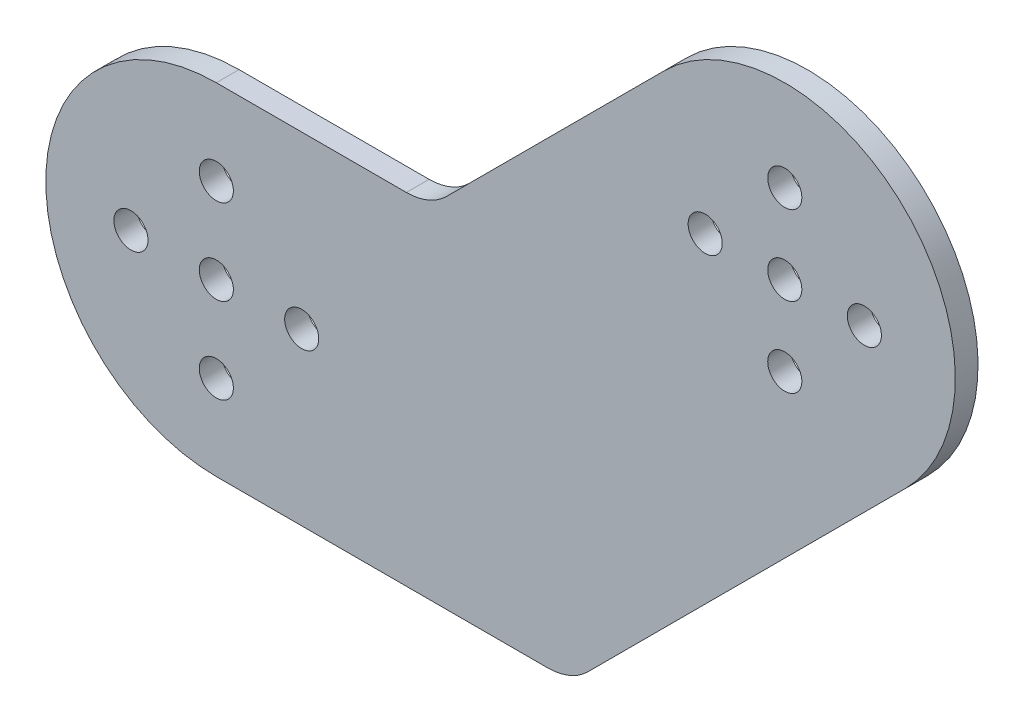
ISO-10303-21;
HEADER;
FILE_DESCRIPTION(('STEP AP214'),'2;1');
FILE_NAME('part.step','',(''),(''),'','','');
FILE_SCHEMA(('AUTOMOTIVE_DESIGN { 1 0 10303 214 1 1 1 1 }'));
ENDSEC;
DATA;
#1=APPLICATION_CONTEXT('core data for automotive mechanical design processes');
#2=APPLICATION_PROTOCOL_DEFINITION('international standard','automotive_design',2000,#1);
#3=PRODUCT_CONTEXT('',#1,'mechanical');
#4=PRODUCT('Part','Part','',(#3));
#5=PRODUCT_RELATED_PRODUCT_CATEGORY('part','',(#4));
#6=PRODUCT_DEFINITION_FORMATION('','',#4);
#7=PRODUCT_DEFINITION_CONTEXT('part definition',#1,'design');
#8=PRODUCT_DEFINITION('design','',#6,#7);
#9=PRODUCT_DEFINITION_SHAPE('','',#8);
#10=(LENGTH_UNIT() NAMED_UNIT(*) SI_UNIT(.MILLI.,.METRE.));
#11=(NAMED_UNIT(*) PLANE_ANGLE_UNIT() SI_UNIT($,.RADIAN.));
#12=(NAMED_UNIT(*) SI_UNIT($,.STERADIAN.) SOLID_ANGLE_UNIT());
#13=UNCERTAINTY_MEASURE_WITH_UNIT(LENGTH_MEASURE(1.E-05),#10,'distance_accuracy_value','');
#14=(GEOMETRIC_REPRESENTATION_CONTEXT(3) GLOBAL_UNCERTAINTY_ASSIGNED_CONTEXT((#13)) GLOBAL_UNIT_ASSIGNED_CONTEXT((#10,
#11,#12)) REPRESENTATION_CONTEXT('',''));
#15=CARTESIAN_POINT('',(0.,0.,0.));
#16=DIRECTION('',(0.,0.,1.));
#17=DIRECTION('',(1.,0.,0.));
#18=AXIS2_PLACEMENT_3D('',#15,#16,#17);
#19=CARTESIAN_POINT('',(0.,0.,2.));
#20=DIRECTION('',(0.,0.,1.));
#21=DIRECTION('',(1.,0.,0.));
#22=AXIS2_PLACEMENT_3D('',#19,#20,#21);
#23=PLANE('',#22);
#24=CARTESIAN_POINT('',(56.9999999995242,24.9999999995243,2.));
#25=DIRECTION('',(0.,0.,1.));
#26=DIRECTION('',(0.,-1.,0.));
#27=AXIS2_PLACEMENT_3D('',#24,#25,#26);
#28=CIRCLE('',#27,1.5);
#29=CARTESIAN_POINT('',(56.9999999995243,23.4999999995243,2.));
#30=VERTEX_POINT('',#29);
#31=EDGE_CURVE('E232',#30,#30,#28,.T.);
#32=ORIENTED_EDGE('',*,*,#31,.F.);
#33=EDGE_LOOP('',(#32));
#34=FACE_BOUND('',#33,.T.);
#35=CARTESIAN_POINT('',(49.9999999995242,17.9999999995242,2.));
#36=DIRECTION('',(0.,0.,1.));
#37=DIRECTION('',(-1.,0.,0.));
#38=AXIS2_PLACEMENT_3D('',#35,#36,#37);
#39=CIRCLE('',#38,1.5);
#40=CARTESIAN_POINT('',(48.4999999995242,17.9999999995242,2.));
#41=VERTEX_POINT('',#40);
#42=EDGE_CURVE('E226',#41,#41,#39,.T.);
#43=ORIENTED_EDGE('',*,*,#42,.F.);
#44=EDGE_LOOP('',(#43));
#45=FACE_BOUND('',#44,.T.);
#46=CARTESIAN_POINT('',(42.9999999995242,24.9999999995242,2.));
#47=DIRECTION('',(0.,0.,1.));
#48=DIRECTION('',(0.,1.,0.));
#49=AXIS2_PLACEMENT_3D('',#46,#47,#48);
#50=CIRCLE('',#49,1.5);
#51=CARTESIAN_POINT('',(42.9999999995242,26.4999999995242,2.));
#52=VERTEX_POINT('',#51);
#53=EDGE_CURVE('E220',#52,#52,#50,.T.);
#54=ORIENTED_EDGE('',*,*,#53,.F.);
#55=EDGE_LOOP('',(#54));
#56=FACE_BOUND('',#55,.T.);
#57=CARTESIAN_POINT('',(49.9999999995242,31.9999999995242,2.));
#58=DIRECTION('',(0.,0.,1.));
#59=DIRECTION('',(1.,0.,0.));
#60=AXIS2_PLACEMENT_3D('',#57,#58,#59);
#61=CIRCLE('',#60,1.5);
#62=CARTESIAN_POINT('',(51.4999999995242,31.9999999995242,2.));
#63=VERTEX_POINT('',#62);
#64=EDGE_CURVE('E214',#63,#63,#61,.T.);
#65=ORIENTED_EDGE('',*,*,#64,.F.);
#66=EDGE_LOOP('',(#65));
#67=FACE_BOUND('',#66,.T.);
#68=CARTESIAN_POINT('',(49.9999999995242,24.9999999995242,2.));
#69=DIRECTION('',(0.,0.,1.));
#70=DIRECTION('',(1.,0.,0.));
#71=AXIS2_PLACEMENT_3D('',#68,#69,#70);
#72=CIRCLE('',#71,1.5);
#73=CARTESIAN_POINT('',(51.4999999995242,24.9999999995242,2.));
#74=VERTEX_POINT('',#73);
#75=EDGE_CURVE('E208',#74,#74,#72,.T.);
#76=ORIENTED_EDGE('',*,*,#75,.F.);
#77=EDGE_LOOP('',(#76));
#78=FACE_BOUND('',#77,.T.);
#79=CARTESIAN_POINT('',(0.,-7.50979876784262,2.));
#80=DIRECTION('',(0.,0.,1.));
#81=DIRECTION('',(-1.,0.,0.));
#82=AXIS2_PLACEMENT_3D('',#79,#80,#81);
#83=CIRCLE('',#82,1.5);
#84=CARTESIAN_POINT('',(-1.5,-7.50979876784262,2.));
#85=VERTEX_POINT('',#84);
#86=EDGE_CURVE('E193',#85,#85,#83,.T.);
#87=ORIENTED_EDGE('',*,*,#86,.F.);
#88=EDGE_LOOP('',(#87));
#89=FACE_BOUND('',#88,.T.);
#90=CARTESIAN_POINT('',(0.,7.50979876784262,2.));
#91=DIRECTION('',(0.,0.,1.));
#92=DIRECTION('',(1.,0.,0.));
#93=AXIS2_PLACEMENT_3D('',#90,#91,#92);
#94=CIRCLE('',#93,1.5);
#95=CARTESIAN_POINT('',(1.5,7.50979876784262,2.));
#96=VERTEX_POINT('',#95);
#97=EDGE_CURVE('E181',#96,#96,#94,.T.);
#98=ORIENTED_EDGE('',*,*,#97,.F.);
#99=EDGE_LOOP('',(#98));
#100=FACE_BOUND('',#99,.T.);
#101=CARTESIAN_POINT('',(0.,0.,2.));
#102=DIRECTION('',(0.,0.,1.));
#103=DIRECTION('',(1.,0.,0.));
#104=AXIS2_PLACEMENT_3D('',#101,#102,#103);
#105=CIRCLE('',#104,15.);
#106=CARTESIAN_POINT('',(0.,15.,2.));
#107=VERTEX_POINT('',#106);
#108=CARTESIAN_POINT('',(0.,-15.,2.));
#109=VERTEX_POINT('',#108);
#110=EDGE_CURVE('E144',#107,#109,#105,.T.);
#111=ORIENTED_EDGE('',*,*,#110,.T.);
#112=DIRECTION('',(1.,0.,0.));
#113=VECTOR('',#112,1.);
#114=CARTESIAN_POINT('',(29.1421356237315,-15.0000000000001,2.));
#115=LINE('',#114,#113);
#116=CARTESIAN_POINT('',(29.1421356237315,-15.0000000000001,2.));
#117=VERTEX_POINT('',#116);
#118=EDGE_CURVE('E92',#109,#117,#115,.T.);
#119=ORIENTED_EDGE('',*,*,#118,.T.);
#120=CARTESIAN_POINT('',(29.1421356237316,-10.0000000000001,2.));
#121=DIRECTION('',(0.,0.,1.));
#122=DIRECTION('',(-1.,0.,0.));
#123=AXIS2_PLACEMENT_3D('',#120,#121,#122);
#124=CIRCLE('',#123,4.99999999999996);
#125=CARTESIAN_POINT('',(32.6776695296644,-13.5355339059327,2.));
#126=VERTEX_POINT('',#125);
#127=EDGE_CURVE('E159',#117,#126,#124,.T.);
#128=ORIENTED_EDGE('',*,*,#127,.T.);
#129=DIRECTION('',(0.707106781186539,0.707106781186556,0.));
#130=VECTOR('',#129,1.);
#131=CARTESIAN_POINT('',(60.6066017173227,14.3933982817263,2.));
#132=LINE('',#131,#130);
#133=CARTESIAN_POINT('',(60.6066017173227,14.3933982817263,2.));
#134=VERTEX_POINT('',#133);
#135=EDGE_CURVE('E172',#126,#134,#132,.T.);
#136=ORIENTED_EDGE('',*,*,#135,.T.);
#137=CARTESIAN_POINT('',(49.9999999995244,24.9999999995244,2.));
#138=DIRECTION('',(0.,0.,1.));
#139=DIRECTION('',(-1.,0.,0.));
#140=AXIS2_PLACEMENT_3D('',#137,#138,#139);
#141=CIRCLE('',#140,15.);
#142=CARTESIAN_POINT('',(39.393398281726,35.6066017173225,2.));
#143=VERTEX_POINT('',#142);
#144=EDGE_CURVE('E111',#134,#143,#141,.T.);
#145=ORIENTED_EDGE('',*,*,#144,.T.);
#146=DIRECTION('',(-0.707106781186539,-0.707106781186556,0.));
#147=VECTOR('',#146,1.);
#148=CARTESIAN_POINT('',(20.2512626584713,16.4644660940672,2.));
#149=LINE('',#148,#147);
#150=CARTESIAN_POINT('',(20.2512626584713,16.4644660940672,2.));
#151=VERTEX_POINT('',#150);
#152=EDGE_CURVE('E105',#143,#151,#149,.T.);
#153=ORIENTED_EDGE('',*,*,#152,.T.);
#154=CARTESIAN_POINT('',(16.7157287525385,19.9999999999999,2.));
#155=DIRECTION('',(0.,0.,-1.));
#156=DIRECTION('',(1.,0.,0.));
#157=AXIS2_PLACEMENT_3D('',#154,#155,#156);
#158=CIRCLE('',#157,5.);
#159=CARTESIAN_POINT('',(16.7157287525385,14.9999999999999,2.));
#160=VERTEX_POINT('',#159);
#161=EDGE_CURVE('E109',#151,#160,#158,.T.);
#162=ORIENTED_EDGE('',*,*,#161,.T.);
#163=DIRECTION('',(-1.,0.,0.));
#164=VECTOR('',#163,1.);
#165=CARTESIAN_POINT('',(0.,15.,2.));
#166=LINE('',#165,#164);
#167=EDGE_CURVE('E49',#160,#107,#166,.T.);
#168=ORIENTED_EDGE('',*,*,#167,.T.);
#169=EDGE_LOOP('',(#111,#119,#128,#136,#145,#153,#162,#168));
#170=FACE_BOUND('',#169,.T.);
#171=CARTESIAN_POINT('',(0.,0.,2.));
#172=DIRECTION('',(0.,0.,1.));
#173=DIRECTION('',(1.,0.,0.));
#174=AXIS2_PLACEMENT_3D('',#171,#172,#173);
#175=CIRCLE('',#174,1.5);
#176=CARTESIAN_POINT('',(1.5,0.,2.));
#177=VERTEX_POINT('',#176);
#178=EDGE_CURVE('E133',#177,#177,#175,.T.);
#179=ORIENTED_EDGE('',*,*,#178,.F.);
#180=EDGE_LOOP('',(#179));
#181=FACE_BOUND('',#180,.T.);
#182=CARTESIAN_POINT('',(-7.50979876784262,0.,2.));
#183=DIRECTION('',(0.,0.,1.));
#184=DIRECTION('',(0.,1.,0.));
#185=AXIS2_PLACEMENT_3D('',#182,#183,#184);
#186=CIRCLE('',#185,1.5);
#187=CARTESIAN_POINT('',(-7.50979876784262,1.49999999999997,2.));
#188=VERTEX_POINT('',#187);
#189=EDGE_CURVE('E187',#188,#188,#186,.T.);
#190=ORIENTED_EDGE('',*,*,#189,.F.);
#191=EDGE_LOOP('',(#190));
#192=FACE_BOUND('',#191,.T.);
#193=CARTESIAN_POINT('',(7.50979876784262,0.,2.));
#194=DIRECTION('',(0.,0.,1.));
#195=DIRECTION('',(0.,-1.,0.));
#196=AXIS2_PLACEMENT_3D('',#193,#194,#195);
#197=CIRCLE('',#196,1.5);
#198=CARTESIAN_POINT('',(7.50979876784263,-1.49999999999992,2.));
#199=VERTEX_POINT('',#198);
#200=EDGE_CURVE('E199',#199,#199,#197,.T.);
#201=ORIENTED_EDGE('',*,*,#200,.F.);
#202=EDGE_LOOP('',(#201));
#203=FACE_BOUND('',#202,.T.);
#204=ADVANCED_FACE('F32',(#34,#45,#56,#67,#78,#89,#100,#170,#181,#192,#203),#23,.T.);
#205=CARTESIAN_POINT('',(0.,0.,0.));
#206=DIRECTION('',(0.,0.,1.));
#207=DIRECTION('',(1.,0.,0.));
#208=AXIS2_PLACEMENT_3D('',#205,#206,#207);
#209=PLANE('',#208);
#210=CARTESIAN_POINT('',(56.9999999995242,24.9999999995243,0.));
#211=DIRECTION('',(0.,0.,1.));
#212=DIRECTION('',(0.,-1.,0.));
#213=AXIS2_PLACEMENT_3D('',#210,#211,#212);
#214=CIRCLE('',#213,1.5);
#215=CARTESIAN_POINT('',(56.9999999995243,23.4999999995243,0.));
#216=VERTEX_POINT('',#215);
#217=EDGE_CURVE('E229',#216,#216,#214,.T.);
#218=ORIENTED_EDGE('',*,*,#217,.T.);
#219=EDGE_LOOP('',(#218));
#220=FACE_BOUND('',#219,.T.);
#221=CARTESIAN_POINT('',(49.9999999995242,17.9999999995242,0.));
#222=DIRECTION('',(0.,0.,1.));
#223=DIRECTION('',(-1.,0.,0.));
#224=AXIS2_PLACEMENT_3D('',#221,#222,#223);
#225=CIRCLE('',#224,1.5);
#226=CARTESIAN_POINT('',(48.4999999995242,17.9999999995242,0.));
#227=VERTEX_POINT('',#226);
#228=EDGE_CURVE('E223',#227,#227,#225,.T.);
#229=ORIENTED_EDGE('',*,*,#228,.T.);
#230=EDGE_LOOP('',(#229));
#231=FACE_BOUND('',#230,.T.);
#232=CARTESIAN_POINT('',(42.9999999995242,24.9999999995242,0.));
#233=DIRECTION('',(0.,0.,1.));
#234=DIRECTION('',(0.,1.,0.));
#235=AXIS2_PLACEMENT_3D('',#232,#233,#234);
#236=CIRCLE('',#235,1.5);
#237=CARTESIAN_POINT('',(42.9999999995242,26.4999999995242,0.));
#238=VERTEX_POINT('',#237);
#239=EDGE_CURVE('E217',#238,#238,#236,.T.);
#240=ORIENTED_EDGE('',*,*,#239,.T.);
#241=EDGE_LOOP('',(#240));
#242=FACE_BOUND('',#241,.T.);
#243=CARTESIAN_POINT('',(49.9999999995242,31.9999999995242,0.));
#244=DIRECTION('',(0.,0.,1.));
#245=DIRECTION('',(1.,0.,0.));
#246=AXIS2_PLACEMENT_3D('',#243,#244,#245);
#247=CIRCLE('',#246,1.5);
#248=CARTESIAN_POINT('',(51.4999999995242,31.9999999995242,0.));
#249=VERTEX_POINT('',#248);
#250=EDGE_CURVE('E211',#249,#249,#247,.T.);
#251=ORIENTED_EDGE('',*,*,#250,.T.);
#252=EDGE_LOOP('',(#251));
#253=FACE_BOUND('',#252,.T.);
#254=CARTESIAN_POINT('',(49.9999999995242,24.9999999995242,0.));
#255=DIRECTION('',(0.,0.,1.));
#256=DIRECTION('',(1.,0.,0.));
#257=AXIS2_PLACEMENT_3D('',#254,#255,#256);
#258=CIRCLE('',#257,1.5);
#259=CARTESIAN_POINT('',(51.4999999995242,24.9999999995242,0.));
#260=VERTEX_POINT('',#259);
#261=EDGE_CURVE('E205',#260,#260,#258,.T.);
#262=ORIENTED_EDGE('',*,*,#261,.T.);
#263=EDGE_LOOP('',(#262));
#264=FACE_BOUND('',#263,.T.);
#265=CARTESIAN_POINT('',(0.,-7.50979876784262,0.));
#266=DIRECTION('',(0.,0.,1.));
#267=DIRECTION('',(-1.,0.,0.));
#268=AXIS2_PLACEMENT_3D('',#265,#266,#267);
#269=CIRCLE('',#268,1.5);
#270=CARTESIAN_POINT('',(-1.5,-7.50979876784262,0.));
#271=VERTEX_POINT('',#270);
#272=EDGE_CURVE('E196',#271,#271,#269,.T.);
#273=ORIENTED_EDGE('',*,*,#272,.T.);
#274=EDGE_LOOP('',(#273));
#275=FACE_BOUND('',#274,.T.);
#276=CARTESIAN_POINT('',(0.,7.50979876784262,0.));
#277=DIRECTION('',(0.,0.,1.));
#278=DIRECTION('',(1.,0.,0.));
#279=AXIS2_PLACEMENT_3D('',#276,#277,#278);
#280=CIRCLE('',#279,1.5);
#281=CARTESIAN_POINT('',(1.5,7.50979876784262,0.));
#282=VERTEX_POINT('',#281);
#283=EDGE_CURVE('E184',#282,#282,#280,.T.);
#284=ORIENTED_EDGE('',*,*,#283,.T.);
#285=EDGE_LOOP('',(#284));
#286=FACE_BOUND('',#285,.T.);
#287=CARTESIAN_POINT('',(0.,0.,0.));
#288=DIRECTION('',(0.,0.,1.));
#289=DIRECTION('',(1.,0.,0.));
#290=AXIS2_PLACEMENT_3D('',#287,#288,#289);
#291=CIRCLE('',#290,15.);
#292=CARTESIAN_POINT('',(0.,15.,0.));
#293=VERTEX_POINT('',#292);
#294=CARTESIAN_POINT('',(0.,-15.,0.));
#295=VERTEX_POINT('',#294);
#296=EDGE_CURVE('E129',#293,#295,#291,.T.);
#297=ORIENTED_EDGE('',*,*,#296,.F.);
#298=DIRECTION('',(-1.,0.,0.));
#299=VECTOR('',#298,1.);
#300=CARTESIAN_POINT('',(0.,15.,0.));
#301=LINE('',#300,#299);
#302=CARTESIAN_POINT('',(16.7157287525385,14.9999999999999,0.));
#303=VERTEX_POINT('',#302);
#304=EDGE_CURVE('E84',#303,#293,#301,.T.);
#305=ORIENTED_EDGE('',*,*,#304,.F.);
#306=CARTESIAN_POINT('',(16.7157287525385,19.9999999999999,0.));
#307=DIRECTION('',(0.,0.,-1.));
#308=DIRECTION('',(1.,0.,0.));
#309=AXIS2_PLACEMENT_3D('',#306,#307,#308);
#310=CIRCLE('',#309,5.);
#311=CARTESIAN_POINT('',(20.2512626584713,16.4644660940672,0.));
#312=VERTEX_POINT('',#311);
#313=EDGE_CURVE('E78',#312,#303,#310,.T.);
#314=ORIENTED_EDGE('',*,*,#313,.F.);
#315=DIRECTION('',(-0.707106781186539,-0.707106781186556,0.));
#316=VECTOR('',#315,1.);
#317=CARTESIAN_POINT('',(20.2512626584713,16.4644660940672,0.));
#318=LINE('',#317,#316);
#319=CARTESIAN_POINT('',(39.393398281726,35.6066017173225,0.));
#320=VERTEX_POINT('',#319);
#321=EDGE_CURVE('E119',#320,#312,#318,.T.);
#322=ORIENTED_EDGE('',*,*,#321,.F.);
#323=CARTESIAN_POINT('',(49.9999999995244,24.9999999995244,0.));
#324=DIRECTION('',(0.,0.,1.));
#325=DIRECTION('',(-1.,0.,0.));
#326=AXIS2_PLACEMENT_3D('',#323,#324,#325);
#327=CIRCLE('',#326,15.);
#328=CARTESIAN_POINT('',(60.6066017173227,14.3933982817263,0.));
#329=VERTEX_POINT('',#328);
#330=EDGE_CURVE('E139',#329,#320,#327,.T.);
#331=ORIENTED_EDGE('',*,*,#330,.F.);
#332=DIRECTION('',(0.707106781186539,0.707106781186556,0.));
#333=VECTOR('',#332,1.);
#334=CARTESIAN_POINT('',(60.6066017173227,14.3933982817263,0.));
#335=LINE('',#334,#333);
#336=CARTESIAN_POINT('',(32.6776695296644,-13.5355339059327,0.));
#337=VERTEX_POINT('',#336);
#338=EDGE_CURVE('E137',#337,#329,#335,.T.);
#339=ORIENTED_EDGE('',*,*,#338,.F.);
#340=CARTESIAN_POINT('',(29.1421356237316,-10.0000000000001,0.));
#341=DIRECTION('',(0.,0.,1.));
#342=DIRECTION('',(-1.,0.,0.));
#343=AXIS2_PLACEMENT_3D('',#340,#341,#342);
#344=CIRCLE('',#343,4.99999999999996);
#345=CARTESIAN_POINT('',(29.1421356237315,-15.0000000000001,0.));
#346=VERTEX_POINT('',#345);
#347=EDGE_CURVE('E135',#346,#337,#344,.T.);
#348=ORIENTED_EDGE('',*,*,#347,.F.);
#349=DIRECTION('',(1.,0.,0.));
#350=VECTOR('',#349,1.);
#351=CARTESIAN_POINT('',(29.1421356237315,-15.0000000000001,0.));
#352=LINE('',#351,#350);
#353=EDGE_CURVE('E132',#295,#346,#352,.T.);
#354=ORIENTED_EDGE('',*,*,#353,.F.);
#355=EDGE_LOOP('',(#297,#305,#314,#322,#331,#339,#348,#354));
#356=FACE_BOUND('',#355,.T.);
#357=CARTESIAN_POINT('',(0.,0.,0.));
#358=DIRECTION('',(0.,0.,1.));
#359=DIRECTION('',(1.,0.,0.));
#360=AXIS2_PLACEMENT_3D('',#357,#358,#359);
#361=CIRCLE('',#360,1.5);
#362=CARTESIAN_POINT('',(1.5,0.,0.));
#363=VERTEX_POINT('',#362);
#364=EDGE_CURVE('E178',#363,#363,#361,.T.);
#365=ORIENTED_EDGE('',*,*,#364,.T.);
#366=EDGE_LOOP('',(#365));
#367=FACE_BOUND('',#366,.T.);
#368=CARTESIAN_POINT('',(-7.50979876784262,0.,0.));
#369=DIRECTION('',(0.,0.,1.));
#370=DIRECTION('',(0.,1.,0.));
#371=AXIS2_PLACEMENT_3D('',#368,#369,#370);
#372=CIRCLE('',#371,1.5);
#373=CARTESIAN_POINT('',(-7.50979876784262,1.49999999999997,0.));
#374=VERTEX_POINT('',#373);
#375=EDGE_CURVE('E190',#374,#374,#372,.T.);
#376=ORIENTED_EDGE('',*,*,#375,.T.);
#377=EDGE_LOOP('',(#376));
#378=FACE_BOUND('',#377,.T.);
#379=CARTESIAN_POINT('',(7.50979876784262,0.,0.));
#380=DIRECTION('',(0.,0.,1.));
#381=DIRECTION('',(0.,-1.,0.));
#382=AXIS2_PLACEMENT_3D('',#379,#380,#381);
#383=CIRCLE('',#382,1.5);
#384=CARTESIAN_POINT('',(7.50979876784263,-1.49999999999992,0.));
#385=VERTEX_POINT('',#384);
#386=EDGE_CURVE('E202',#385,#385,#383,.T.);
#387=ORIENTED_EDGE('',*,*,#386,.T.);
#388=EDGE_LOOP('',(#387));
#389=FACE_BOUND('',#388,.T.);
#390=ADVANCED_FACE('F163',(#220,#231,#242,#253,#264,#275,#286,#356,#367,#378,#389),#209,.F.);
#391=CARTESIAN_POINT('',(0.,0.,2.));
#392=DIRECTION('',(0.,0.,-1.));
#393=DIRECTION('',(-1.,0.,0.));
#394=AXIS2_PLACEMENT_3D('',#391,#392,#393);
#395=CYLINDRICAL_SURFACE('',#394,15.);
#396=ORIENTED_EDGE('',*,*,#296,.T.);
#397=DIRECTION('',(0.,0.,-1.));
#398=VECTOR('',#397,1.);
#399=CARTESIAN_POINT('',(0.,-15.,2.));
#400=LINE('',#399,#398);
#401=EDGE_CURVE('E11',#109,#295,#400,.T.);
#402=ORIENTED_EDGE('',*,*,#401,.F.);
#403=ORIENTED_EDGE('',*,*,#110,.F.);
#404=DIRECTION('',(0.,0.,-1.));
#405=VECTOR('',#404,1.);
#406=CARTESIAN_POINT('',(0.,15.,2.));
#407=LINE('',#406,#405);
#408=EDGE_CURVE('E125',#107,#293,#407,.T.);
#409=ORIENTED_EDGE('',*,*,#408,.T.);
#410=EDGE_LOOP('',(#396,#402,#403,#409));
#411=FACE_BOUND('',#410,.T.);
#412=ADVANCED_FACE('F34',(#411),#395,.T.);
#413=CARTESIAN_POINT('',(29.1421356237315,-15.0000000000001,2.));
#414=DIRECTION('',(0.,1.,0.));
#415=DIRECTION('',(-1.,0.,0.));
#416=AXIS2_PLACEMENT_3D('',#413,#414,#415);
#417=PLANE('',#416);
#418=ORIENTED_EDGE('',*,*,#353,.T.);
#419=DIRECTION('',(0.,0.,-1.));
#420=VECTOR('',#419,1.);
#421=CARTESIAN_POINT('',(29.1421356237315,-15.0000000000001,2.));
#422=LINE('',#421,#420);
#423=EDGE_CURVE('E41',#117,#346,#422,.T.);
#424=ORIENTED_EDGE('',*,*,#423,.F.);
#425=ORIENTED_EDGE('',*,*,#118,.F.);
#426=ORIENTED_EDGE('',*,*,#401,.T.);
#427=EDGE_LOOP('',(#418,#424,#425,#426));
#428=FACE_BOUND('',#427,.T.);
#429=ADVANCED_FACE('F275',(#428),#417,.F.);
#430=CARTESIAN_POINT('',(29.1421356237316,-10.0000000000001,2.));
#431=DIRECTION('',(0.,0.,-1.));
#432=DIRECTION('',(-1.,0.,0.));
#433=AXIS2_PLACEMENT_3D('',#430,#431,#432);
#434=CYLINDRICAL_SURFACE('',#433,4.99999999999996);
#435=ORIENTED_EDGE('',*,*,#347,.T.);
#436=DIRECTION('',(0.,0.,-1.));
#437=VECTOR('',#436,1.);
#438=CARTESIAN_POINT('',(32.6776695296644,-13.5355339059327,2.));
#439=LINE('',#438,#437);
#440=EDGE_CURVE('E151',#126,#337,#439,.T.);
#441=ORIENTED_EDGE('',*,*,#440,.F.);
#442=ORIENTED_EDGE('',*,*,#127,.F.);
#443=ORIENTED_EDGE('',*,*,#423,.T.);
#444=EDGE_LOOP('',(#435,#441,#442,#443));
#445=FACE_BOUND('',#444,.T.);
#446=ADVANCED_FACE('F157',(#445),#434,.T.);
#447=CARTESIAN_POINT('',(60.6066017173227,14.3933982817263,2.));
#448=DIRECTION('',(-0.707106781186556,0.707106781186539,0.));
#449=DIRECTION('',(-0.707106781186539,-0.707106781186556,0.));
#450=AXIS2_PLACEMENT_3D('',#447,#448,#449);
#451=PLANE('',#450);
#452=ORIENTED_EDGE('',*,*,#338,.T.);
#453=DIRECTION('',(0.,0.,-1.));
#454=VECTOR('',#453,1.);
#455=CARTESIAN_POINT('',(60.6066017173227,14.3933982817263,2.));
#456=LINE('',#455,#454);
#457=EDGE_CURVE('E148',#134,#329,#456,.T.);
#458=ORIENTED_EDGE('',*,*,#457,.F.);
#459=ORIENTED_EDGE('',*,*,#135,.F.);
#460=ORIENTED_EDGE('',*,*,#440,.T.);
#461=EDGE_LOOP('',(#452,#458,#459,#460));
#462=FACE_BOUND('',#461,.T.);
#463=ADVANCED_FACE('F168',(#462),#451,.F.);
#464=CARTESIAN_POINT('',(49.9999999995244,24.9999999995244,2.));
#465=DIRECTION('',(0.,0.,-1.));
#466=DIRECTION('',(-1.,0.,0.));
#467=AXIS2_PLACEMENT_3D('',#464,#465,#466);
#468=CYLINDRICAL_SURFACE('',#467,15.);
#469=ORIENTED_EDGE('',*,*,#330,.T.);
#470=DIRECTION('',(0.,0.,-1.));
#471=VECTOR('',#470,1.);
#472=CARTESIAN_POINT('',(39.393398281726,35.6066017173225,2.));
#473=LINE('',#472,#471);
#474=EDGE_CURVE('E120',#143,#320,#473,.T.);
#475=ORIENTED_EDGE('',*,*,#474,.F.);
#476=ORIENTED_EDGE('',*,*,#144,.F.);
#477=ORIENTED_EDGE('',*,*,#457,.T.);
#478=EDGE_LOOP('',(#469,#475,#476,#477));
#479=FACE_BOUND('',#478,.T.);
#480=ADVANCED_FACE('F171',(#479),#468,.T.);
#481=CARTESIAN_POINT('',(20.2512626584713,16.4644660940672,2.));
#482=DIRECTION('',(0.707106781186556,-0.707106781186539,0.));
#483=DIRECTION('',(0.707106781186539,0.707106781186556,0.));
#484=AXIS2_PLACEMENT_3D('',#481,#482,#483);
#485=PLANE('',#484);
#486=ORIENTED_EDGE('',*,*,#321,.T.);
#487=DIRECTION('',(0.,0.,-1.));
#488=VECTOR('',#487,1.);
#489=CARTESIAN_POINT('',(20.2512626584713,16.4644660940672,2.));
#490=LINE('',#489,#488);
#491=EDGE_CURVE('E116',#151,#312,#490,.T.);
#492=ORIENTED_EDGE('',*,*,#491,.F.);
#493=ORIENTED_EDGE('',*,*,#152,.F.);
#494=ORIENTED_EDGE('',*,*,#474,.T.);
#495=EDGE_LOOP('',(#486,#492,#493,#494));
#496=FACE_BOUND('',#495,.T.);
#497=ADVANCED_FACE('F117',(#496),#485,.F.);
#498=CARTESIAN_POINT('',(16.7157287525385,19.9999999999999,2.));
#499=DIRECTION('',(0.,0.,-1.));
#500=DIRECTION('',(-1.,0.,0.));
#501=AXIS2_PLACEMENT_3D('',#498,#499,#500);
#502=CYLINDRICAL_SURFACE('',#501,5.);
#503=ORIENTED_EDGE('',*,*,#313,.T.);
#504=DIRECTION('',(0.,0.,-1.));
#505=VECTOR('',#504,1.);
#506=CARTESIAN_POINT('',(16.7157287525385,14.9999999999999,2.));
#507=LINE('',#506,#505);
#508=EDGE_CURVE('E121',#160,#303,#507,.T.);
#509=ORIENTED_EDGE('',*,*,#508,.F.);
#510=ORIENTED_EDGE('',*,*,#161,.F.);
#511=ORIENTED_EDGE('',*,*,#491,.T.);
#512=EDGE_LOOP('',(#503,#509,#510,#511));
#513=FACE_BOUND('',#512,.T.);
#514=ADVANCED_FACE('F123',(#513),#502,.F.);
#515=CARTESIAN_POINT('',(0.,15.,2.));
#516=DIRECTION('',(0.,-1.,0.));
#517=DIRECTION('',(1.,0.,0.));
#518=AXIS2_PLACEMENT_3D('',#515,#516,#517);
#519=PLANE('',#518);
#520=ORIENTED_EDGE('',*,*,#304,.T.);
#521=ORIENTED_EDGE('',*,*,#408,.F.);
#522=ORIENTED_EDGE('',*,*,#167,.F.);
#523=ORIENTED_EDGE('',*,*,#508,.T.);
#524=EDGE_LOOP('',(#520,#521,#522,#523));
#525=FACE_BOUND('',#524,.T.);
#526=ADVANCED_FACE('F279',(#525),#519,.F.);
#527=CARTESIAN_POINT('',(0.,0.,2.));
#528=DIRECTION('',(0.,0.,-1.));
#529=DIRECTION('',(-1.,0.,0.));
#530=AXIS2_PLACEMENT_3D('',#527,#528,#529);
#531=CYLINDRICAL_SURFACE('',#530,1.5);
#532=ORIENTED_EDGE('',*,*,#178,.T.);
#533=EDGE_LOOP('',(#532));
#534=FACE_BOUND('',#533,.T.);
#535=ORIENTED_EDGE('',*,*,#364,.F.);
#536=EDGE_LOOP('',(#535));
#537=FACE_BOUND('',#536,.T.);
#538=ADVANCED_FACE('F266',(#534,#537),#531,.F.);
#539=CARTESIAN_POINT('',(0.,7.50979876784262,2.));
#540=DIRECTION('',(0.,0.,-1.));
#541=DIRECTION('',(-1.,0.,0.));
#542=AXIS2_PLACEMENT_3D('',#539,#540,#541);
#543=CYLINDRICAL_SURFACE('',#542,1.5);
#544=ORIENTED_EDGE('',*,*,#97,.T.);
#545=EDGE_LOOP('',(#544));
#546=FACE_BOUND('',#545,.T.);
#547=ORIENTED_EDGE('',*,*,#283,.F.);
#548=EDGE_LOOP('',(#547));
#549=FACE_BOUND('',#548,.T.);
#550=ADVANCED_FACE('F262',(#546,#549),#543,.F.);
#551=CARTESIAN_POINT('',(-7.50979876784262,0.,2.));
#552=DIRECTION('',(0.,0.,-1.));
#553=DIRECTION('',(-1.,0.,0.));
#554=AXIS2_PLACEMENT_3D('',#551,#552,#553);
#555=CYLINDRICAL_SURFACE('',#554,1.5);
#556=ORIENTED_EDGE('',*,*,#189,.T.);
#557=EDGE_LOOP('',(#556));
#558=FACE_BOUND('',#557,.T.);
#559=ORIENTED_EDGE('',*,*,#375,.F.);
#560=EDGE_LOOP('',(#559));
#561=FACE_BOUND('',#560,.T.);
#562=ADVANCED_FACE('F265',(#558,#561),#555,.F.);
#563=CARTESIAN_POINT('',(0.,-7.50979876784262,2.));
#564=DIRECTION('',(0.,0.,-1.));
#565=DIRECTION('',(-1.,0.,0.));
#566=AXIS2_PLACEMENT_3D('',#563,#564,#565);
#567=CYLINDRICAL_SURFACE('',#566,1.5);
#568=ORIENTED_EDGE('',*,*,#86,.T.);
#569=EDGE_LOOP('',(#568));
#570=FACE_BOUND('',#569,.T.);
#571=ORIENTED_EDGE('',*,*,#272,.F.);
#572=EDGE_LOOP('',(#571));
#573=FACE_BOUND('',#572,.T.);
#574=ADVANCED_FACE('F338',(#570,#573),#567,.F.);
#575=CARTESIAN_POINT('',(7.50979876784262,0.,2.));
#576=DIRECTION('',(0.,0.,-1.));
#577=DIRECTION('',(-1.,0.,0.));
#578=AXIS2_PLACEMENT_3D('',#575,#576,#577);
#579=CYLINDRICAL_SURFACE('',#578,1.5);
#580=ORIENTED_EDGE('',*,*,#200,.T.);
#581=EDGE_LOOP('',(#580));
#582=FACE_BOUND('',#581,.T.);
#583=ORIENTED_EDGE('',*,*,#386,.F.);
#584=EDGE_LOOP('',(#583));
#585=FACE_BOUND('',#584,.T.);
#586=ADVANCED_FACE('F346',(#582,#585),#579,.F.);
#587=CARTESIAN_POINT('',(49.9999999995242,24.9999999995242,0.));
#588=DIRECTION('',(0.,0.,1.));
#589=DIRECTION('',(1.,0.,0.));
#590=AXIS2_PLACEMENT_3D('',#587,#588,#589);
#591=CYLINDRICAL_SURFACE('',#590,1.5);
#592=ORIENTED_EDGE('',*,*,#261,.F.);
#593=EDGE_LOOP('',(#592));
#594=FACE_BOUND('',#593,.T.);
#595=ORIENTED_EDGE('',*,*,#75,.T.);
#596=EDGE_LOOP('',(#595));
#597=FACE_BOUND('',#596,.T.);
#598=ADVANCED_FACE('F354',(#594,#597),#591,.F.);
#599=CARTESIAN_POINT('',(49.9999999995242,31.9999999995242,0.));
#600=DIRECTION('',(0.,0.,1.));
#601=DIRECTION('',(1.,0.,0.));
#602=AXIS2_PLACEMENT_3D('',#599,#600,#601);
#603=CYLINDRICAL_SURFACE('',#602,1.5);
#604=ORIENTED_EDGE('',*,*,#250,.F.);
#605=EDGE_LOOP('',(#604));
#606=FACE_BOUND('',#605,.T.);
#607=ORIENTED_EDGE('',*,*,#64,.T.);
#608=EDGE_LOOP('',(#607));
#609=FACE_BOUND('',#608,.T.);
#610=ADVANCED_FACE('F362',(#606,#609),#603,.F.);
#611=CARTESIAN_POINT('',(42.9999999995242,24.9999999995242,0.));
#612=DIRECTION('',(0.,0.,1.));
#613=DIRECTION('',(1.,0.,0.));
#614=AXIS2_PLACEMENT_3D('',#611,#612,#613);
#615=CYLINDRICAL_SURFACE('',#614,1.5);
#616=ORIENTED_EDGE('',*,*,#239,.F.);
#617=EDGE_LOOP('',(#616));
#618=FACE_BOUND('',#617,.T.);
#619=ORIENTED_EDGE('',*,*,#53,.T.);
#620=EDGE_LOOP('',(#619));
#621=FACE_BOUND('',#620,.T.);
#622=ADVANCED_FACE('F370',(#618,#621),#615,.F.);
#623=CARTESIAN_POINT('',(49.9999999995242,17.9999999995242,0.));
#624=DIRECTION('',(0.,0.,1.));
#625=DIRECTION('',(1.,0.,0.));
#626=AXIS2_PLACEMENT_3D('',#623,#624,#625);
#627=CYLINDRICAL_SURFACE('',#626,1.5);
#628=ORIENTED_EDGE('',*,*,#228,.F.);
#629=EDGE_LOOP('',(#628));
#630=FACE_BOUND('',#629,.T.);
#631=ORIENTED_EDGE('',*,*,#42,.T.);
#632=EDGE_LOOP('',(#631));
#633=FACE_BOUND('',#632,.T.);
#634=ADVANCED_FACE('F243',(#630,#633),#627,.F.);
#635=CARTESIAN_POINT('',(56.9999999995242,24.9999999995243,0.));
#636=DIRECTION('',(0.,0.,1.));
#637=DIRECTION('',(1.,0.,0.));
#638=AXIS2_PLACEMENT_3D('',#635,#636,#637);
#639=CYLINDRICAL_SURFACE('',#638,1.5);
#640=ORIENTED_EDGE('',*,*,#217,.F.);
#641=EDGE_LOOP('',(#640));
#642=FACE_BOUND('',#641,.T.);
#643=ORIENTED_EDGE('',*,*,#31,.T.);
#644=EDGE_LOOP('',(#643));
#645=FACE_BOUND('',#644,.T.);
#646=ADVANCED_FACE('F240',(#642,#645),#639,.F.);
#647=CLOSED_SHELL('',(#204,#390,#412,#429,#446,#463,#480,#497,#514,#526,#538,#550,#562,#574,
#586,#598,#610,#622,#634,#646));
#648=MANIFOLD_SOLID_BREP('B2',#647);
#649=ADVANCED_BREP_SHAPE_REPRESENTATION('',(#18,#648),#14);
#650=SHAPE_DEFINITION_REPRESENTATION(#9,#649);
ENDSEC;
END-ISO-10303-21;
